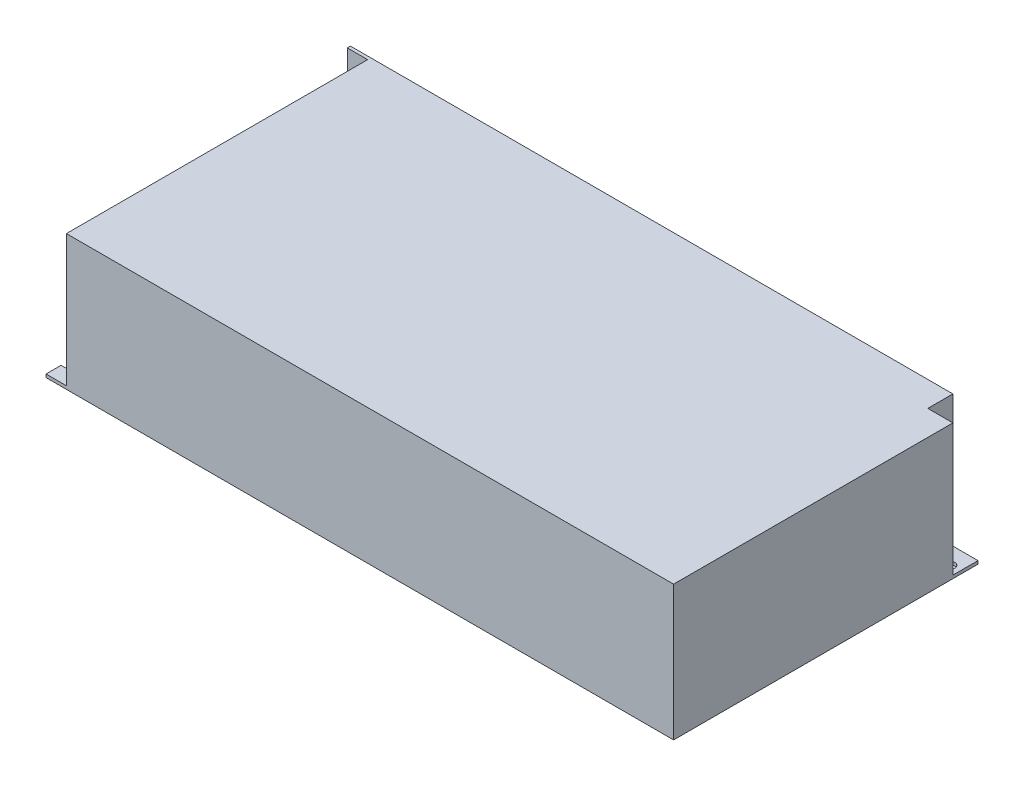
ISO-10303-21;
HEADER;
FILE_DESCRIPTION(('STEP AP214'),'2;1');
FILE_NAME('part.step','',(''),(''),'','','');
FILE_SCHEMA(('AUTOMOTIVE_DESIGN { 1 0 10303 214 1 1 1 1 }'));
ENDSEC;
DATA;
#1=APPLICATION_CONTEXT('core data for automotive mechanical design processes');
#2=APPLICATION_PROTOCOL_DEFINITION('international standard','automotive_design',2000,#1);
#3=PRODUCT_CONTEXT('',#1,'mechanical');
#4=PRODUCT('Part','Part','',(#3));
#5=PRODUCT_RELATED_PRODUCT_CATEGORY('part','',(#4));
#6=PRODUCT_DEFINITION_FORMATION('','',#4);
#7=PRODUCT_DEFINITION_CONTEXT('part definition',#1,'design');
#8=PRODUCT_DEFINITION('design','',#6,#7);
#9=PRODUCT_DEFINITION_SHAPE('','',#8);
#10=(LENGTH_UNIT() NAMED_UNIT(*) SI_UNIT(.MILLI.,.METRE.));
#11=(NAMED_UNIT(*) PLANE_ANGLE_UNIT() SI_UNIT($,.RADIAN.));
#12=(NAMED_UNIT(*) SI_UNIT($,.STERADIAN.) SOLID_ANGLE_UNIT());
#13=UNCERTAINTY_MEASURE_WITH_UNIT(LENGTH_MEASURE(1.E-05),#10,'distance_accuracy_value','');
#14=(GEOMETRIC_REPRESENTATION_CONTEXT(3) GLOBAL_UNCERTAINTY_ASSIGNED_CONTEXT((#13)) GLOBAL_UNIT_ASSIGNED_CONTEXT((#10,
#11,#12)) REPRESENTATION_CONTEXT('',''));
#15=CARTESIAN_POINT('',(0.,0.,0.));
#16=DIRECTION('',(0.,0.,1.));
#17=DIRECTION('',(1.,0.,0.));
#18=AXIS2_PLACEMENT_3D('',#15,#16,#17);
#19=CARTESIAN_POINT('',(-100.,43.,-48.5));
#20=DIRECTION('',(1.,0.,0.));
#21=DIRECTION('',(0.,0.,-1.));
#22=AXIS2_PLACEMENT_3D('',#19,#20,#21);
#23=PLANE('',#22);
#24=DIRECTION('',(0.,0.,-1.));
#25=VECTOR('',#24,1.);
#26=CARTESIAN_POINT('',(-100.,1.,48.5));
#27=LINE('',#26,#25);
#28=CARTESIAN_POINT('',(-100.,1.,48.5));
#29=VERTEX_POINT('',#28);
#30=CARTESIAN_POINT('',(-100.,1.,43.7));
#31=VERTEX_POINT('',#30);
#32=EDGE_CURVE('E206',#29,#31,#27,.T.);
#33=ORIENTED_EDGE('',*,*,#32,.T.);
#34=DIRECTION('',(0.,-1.,0.));
#35=VECTOR('',#34,1.);
#36=CARTESIAN_POINT('',(-100.,43.,43.7));
#37=LINE('',#36,#35);
#38=CARTESIAN_POINT('',(-100.,0.,43.7));
#39=VERTEX_POINT('',#38);
#40=EDGE_CURVE('E195',#31,#39,#37,.T.);
#41=ORIENTED_EDGE('',*,*,#40,.T.);
#42=DIRECTION('',(0.,0.,1.));
#43=VECTOR('',#42,1.);
#44=CARTESIAN_POINT('',(-100.,0.,-48.5));
#45=LINE('',#44,#43);
#46=CARTESIAN_POINT('',(-100.,0.,48.5));
#47=VERTEX_POINT('',#46);
#48=EDGE_CURVE('E281',#39,#47,#45,.T.);
#49=ORIENTED_EDGE('',*,*,#48,.T.);
#50=DIRECTION('',(0.,-1.,0.));
#51=VECTOR('',#50,1.);
#52=CARTESIAN_POINT('',(-100.,43.,48.5));
#53=LINE('',#52,#51);
#54=EDGE_CURVE('E287',#29,#47,#53,.T.);
#55=ORIENTED_EDGE('',*,*,#54,.F.);
#56=EDGE_LOOP('',(#33,#41,#49,#55));
#57=FACE_BOUND('',#56,.T.);
#58=ADVANCED_FACE('F41',(#57),#23,.F.);
#59=CARTESIAN_POINT('',(100.,43.,-48.5));
#60=DIRECTION('',(-1.,0.,0.));
#61=DIRECTION('',(0.,0.,1.));
#62=AXIS2_PLACEMENT_3D('',#59,#60,#61);
#63=PLANE('',#62);
#64=DIRECTION('',(0.,0.,1.));
#65=VECTOR('',#64,1.);
#66=CARTESIAN_POINT('',(100.,1.,-48.5));
#67=LINE('',#66,#65);
#68=CARTESIAN_POINT('',(100.,1.,-48.5));
#69=VERTEX_POINT('',#68);
#70=CARTESIAN_POINT('',(100.,1.,-40.5));
#71=VERTEX_POINT('',#70);
#72=EDGE_CURVE('E220',#69,#71,#67,.T.);
#73=ORIENTED_EDGE('',*,*,#72,.T.);
#74=DIRECTION('',(0.,1.,0.));
#75=VECTOR('',#74,1.);
#76=CARTESIAN_POINT('',(100.,-14.5344418537486,-40.5));
#77=LINE('',#76,#75);
#78=CARTESIAN_POINT('',(100.,43.,-40.5));
#79=VERTEX_POINT('',#78);
#80=EDGE_CURVE('E225',#71,#79,#77,.T.);
#81=ORIENTED_EDGE('',*,*,#80,.T.);
#82=DIRECTION('',(0.,0.,-1.));
#83=VECTOR('',#82,1.);
#84=CARTESIAN_POINT('',(100.,43.,-48.5));
#85=LINE('',#84,#83);
#86=CARTESIAN_POINT('',(100.,43.,48.5));
#87=VERTEX_POINT('',#86);
#88=EDGE_CURVE('E265',#87,#79,#85,.T.);
#89=ORIENTED_EDGE('',*,*,#88,.F.);
#90=DIRECTION('',(0.,-1.,0.));
#91=VECTOR('',#90,1.);
#92=CARTESIAN_POINT('',(100.,43.,48.5));
#93=LINE('',#92,#91);
#94=CARTESIAN_POINT('',(100.,0.,48.5));
#95=VERTEX_POINT('',#94);
#96=EDGE_CURVE('E276',#87,#95,#93,.T.);
#97=ORIENTED_EDGE('',*,*,#96,.T.);
#98=DIRECTION('',(0.,0.,-1.));
#99=VECTOR('',#98,1.);
#100=CARTESIAN_POINT('',(100.,0.,-48.5));
#101=LINE('',#100,#99);
#102=CARTESIAN_POINT('',(100.,0.,-48.5));
#103=VERTEX_POINT('',#102);
#104=EDGE_CURVE('E264',#95,#103,#101,.T.);
#105=ORIENTED_EDGE('',*,*,#104,.T.);
#106=DIRECTION('',(0.,-1.,0.));
#107=VECTOR('',#106,1.);
#108=CARTESIAN_POINT('',(100.,43.,-48.5));
#109=LINE('',#108,#107);
#110=EDGE_CURVE('E293',#69,#103,#109,.T.);
#111=ORIENTED_EDGE('',*,*,#110,.F.);
#112=EDGE_LOOP('',(#73,#81,#89,#97,#105,#111));
#113=FACE_BOUND('',#112,.T.);
#114=ADVANCED_FACE('F43',(#113),#63,.F.);
#115=CARTESIAN_POINT('',(-100.,43.,-48.5));
#116=DIRECTION('',(0.,0.,1.));
#117=DIRECTION('',(1.,0.,0.));
#118=AXIS2_PLACEMENT_3D('',#115,#116,#117);
#119=PLANE('',#118);
#120=DIRECTION('',(-1.,0.,0.));
#121=VECTOR('',#120,1.);
#122=CARTESIAN_POINT('',(-100.,43.,-48.5));
#123=LINE('',#122,#121);
#124=CARTESIAN_POINT('',(91.9999999999999,43.,-48.5));
#125=VERTEX_POINT('',#124);
#126=CARTESIAN_POINT('',(-100.,43.,-48.5));
#127=VERTEX_POINT('',#126);
#128=EDGE_CURVE('E268',#125,#127,#123,.T.);
#129=ORIENTED_EDGE('',*,*,#128,.F.);
#130=DIRECTION('',(0.,1.,0.));
#131=VECTOR('',#130,1.);
#132=CARTESIAN_POINT('',(92.,-14.5344418537486,-48.5));
#133=LINE('',#132,#131);
#134=CARTESIAN_POINT('',(92.,1.,-48.5));
#135=VERTEX_POINT('',#134);
#136=EDGE_CURVE('E64',#135,#125,#133,.T.);
#137=ORIENTED_EDGE('',*,*,#136,.F.);
#138=DIRECTION('',(1.,0.,0.));
#139=VECTOR('',#138,1.);
#140=CARTESIAN_POINT('',(100.,1.,-48.5));
#141=LINE('',#140,#139);
#142=EDGE_CURVE('E198',#135,#69,#141,.T.);
#143=ORIENTED_EDGE('',*,*,#142,.T.);
#144=ORIENTED_EDGE('',*,*,#110,.T.);
#145=DIRECTION('',(-1.,0.,0.));
#146=VECTOR('',#145,1.);
#147=CARTESIAN_POINT('',(-100.,0.,-48.5));
#148=LINE('',#147,#146);
#149=CARTESIAN_POINT('',(-100.,0.,-48.5));
#150=VERTEX_POINT('',#149);
#151=EDGE_CURVE('E279',#103,#150,#148,.T.);
#152=ORIENTED_EDGE('',*,*,#151,.T.);
#153=DIRECTION('',(0.,-1.,0.));
#154=VECTOR('',#153,1.);
#155=CARTESIAN_POINT('',(-100.,43.,-48.5));
#156=LINE('',#155,#154);
#157=EDGE_CURVE('E290',#127,#150,#156,.T.);
#158=ORIENTED_EDGE('',*,*,#157,.F.);
#159=EDGE_LOOP('',(#129,#137,#143,#144,#152,#158));
#160=FACE_BOUND('',#159,.T.);
#161=ADVANCED_FACE('F360',(#160),#119,.F.);
#162=CARTESIAN_POINT('',(-100.,0.,39.9));
#163=VERTEX_POINT('',#162);
#164=EDGE_CURVE('E282',#150,#163,#45,.T.);
#165=ORIENTED_EDGE('',*,*,#164,.T.);
#166=DIRECTION('',(0.,1.,0.));
#167=VECTOR('',#166,1.);
#168=CARTESIAN_POINT('',(-100.,43.,39.9));
#169=LINE('',#168,#167);
#170=CARTESIAN_POINT('',(-100.,1.,39.9));
#171=VERTEX_POINT('',#170);
#172=EDGE_CURVE('E174',#163,#171,#169,.T.);
#173=ORIENTED_EDGE('',*,*,#172,.T.);
#174=CARTESIAN_POINT('',(-100.,1.,35.5));
#175=VERTEX_POINT('',#174);
#176=EDGE_CURVE('E205',#171,#175,#27,.T.);
#177=ORIENTED_EDGE('',*,*,#176,.T.);
#178=DIRECTION('',(0.,1.,0.));
#179=VECTOR('',#178,1.);
#180=CARTESIAN_POINT('',(-100.,-14.5344418537486,35.5));
#181=LINE('',#180,#179);
#182=CARTESIAN_POINT('',(-100.,2.07013091562576,35.5));
#183=VERTEX_POINT('',#182);
#184=EDGE_CURVE('E203',#175,#183,#181,.T.);
#185=ORIENTED_EDGE('',*,*,#184,.T.);
#186=DIRECTION('',(0.,0.,1.));
#187=VECTOR('',#186,1.);
#188=CARTESIAN_POINT('',(-100.,2.07013091562571,-89.942782040592));
#189=LINE('',#188,#187);
#190=CARTESIAN_POINT('',(-100.,2.07013091562571,-47.5));
#191=VERTEX_POINT('',#190);
#192=EDGE_CURVE('E252',#191,#183,#189,.T.);
#193=ORIENTED_EDGE('',*,*,#192,.F.);
#194=DIRECTION('',(0.,1.,0.));
#195=VECTOR('',#194,1.);
#196=CARTESIAN_POINT('',(-100.,43.,-47.5));
#197=LINE('',#196,#195);
#198=CARTESIAN_POINT('',(-100.,43.,-47.5));
#199=VERTEX_POINT('',#198);
#200=EDGE_CURVE('E249',#191,#199,#197,.T.);
#201=ORIENTED_EDGE('',*,*,#200,.T.);
#202=DIRECTION('',(0.,0.,1.));
#203=VECTOR('',#202,1.);
#204=CARTESIAN_POINT('',(-100.,43.,-48.5));
#205=LINE('',#204,#203);
#206=EDGE_CURVE('E271',#127,#199,#205,.T.);
#207=ORIENTED_EDGE('',*,*,#206,.F.);
#208=ORIENTED_EDGE('',*,*,#157,.T.);
#209=EDGE_LOOP('',(#165,#173,#177,#185,#193,#201,#207,#208));
#210=FACE_BOUND('',#209,.T.);
#211=ADVANCED_FACE('F312',(#210),#23,.F.);
#212=CARTESIAN_POINT('',(-100.,43.,48.5));
#213=DIRECTION('',(0.,0.,-1.));
#214=DIRECTION('',(-1.,0.,0.));
#215=AXIS2_PLACEMENT_3D('',#212,#213,#214);
#216=PLANE('',#215);
#217=DIRECTION('',(0.,1.,0.));
#218=VECTOR('',#217,1.);
#219=CARTESIAN_POINT('',(-93.5,43.,48.5));
#220=LINE('',#219,#218);
#221=CARTESIAN_POINT('',(-93.5,1.,48.5));
#222=VERTEX_POINT('',#221);
#223=CARTESIAN_POINT('',(-93.5,43.,48.5));
#224=VERTEX_POINT('',#223);
#225=EDGE_CURVE('E238',#222,#224,#220,.T.);
#226=ORIENTED_EDGE('',*,*,#225,.F.);
#227=DIRECTION('',(-1.,0.,0.));
#228=VECTOR('',#227,1.);
#229=CARTESIAN_POINT('',(-100.,1.,48.5));
#230=LINE('',#229,#228);
#231=EDGE_CURVE('E209',#222,#29,#230,.T.);
#232=ORIENTED_EDGE('',*,*,#231,.T.);
#233=ORIENTED_EDGE('',*,*,#54,.T.);
#234=DIRECTION('',(1.,0.,0.));
#235=VECTOR('',#234,1.);
#236=CARTESIAN_POINT('',(-100.,0.,48.5));
#237=LINE('',#236,#235);
#238=EDGE_CURVE('E269',#47,#95,#237,.T.);
#239=ORIENTED_EDGE('',*,*,#238,.T.);
#240=ORIENTED_EDGE('',*,*,#96,.F.);
#241=DIRECTION('',(1.,0.,0.));
#242=VECTOR('',#241,1.);
#243=CARTESIAN_POINT('',(-100.,43.,48.5));
#244=LINE('',#243,#242);
#245=EDGE_CURVE('E274',#224,#87,#244,.T.);
#246=ORIENTED_EDGE('',*,*,#245,.F.);
#247=EDGE_LOOP('',(#226,#232,#233,#239,#240,#246));
#248=FACE_BOUND('',#247,.T.);
#249=ADVANCED_FACE('F339',(#248),#216,.F.);
#250=CARTESIAN_POINT('',(0.,43.,0.));
#251=DIRECTION('',(0.,1.,0.));
#252=DIRECTION('',(0.,0.,1.));
#253=AXIS2_PLACEMENT_3D('',#250,#251,#252);
#254=PLANE('',#253);
#255=DIRECTION('',(1.,0.,0.));
#256=VECTOR('',#255,1.);
#257=CARTESIAN_POINT('',(100.,43.,-40.5));
#258=LINE('',#257,#256);
#259=CARTESIAN_POINT('',(92.,43.,-40.5));
#260=VERTEX_POINT('',#259);
#261=EDGE_CURVE('E222',#260,#79,#258,.T.);
#262=ORIENTED_EDGE('',*,*,#261,.F.);
#263=DIRECTION('',(0.,0.,1.));
#264=VECTOR('',#263,1.);
#265=CARTESIAN_POINT('',(92.,43.,-48.5));
#266=LINE('',#265,#264);
#267=EDGE_CURVE('E214',#125,#260,#266,.T.);
#268=ORIENTED_EDGE('',*,*,#267,.F.);
#269=ORIENTED_EDGE('',*,*,#128,.T.);
#270=ORIENTED_EDGE('',*,*,#206,.T.);
#271=DIRECTION('',(1.,0.,0.));
#272=VECTOR('',#271,1.);
#273=CARTESIAN_POINT('',(-93.5,43.,-47.5));
#274=LINE('',#273,#272);
#275=CARTESIAN_POINT('',(-93.5,43.,-47.5));
#276=VERTEX_POINT('',#275);
#277=EDGE_CURVE('E246',#199,#276,#274,.T.);
#278=ORIENTED_EDGE('',*,*,#277,.T.);
#279=DIRECTION('',(0.,0.,1.));
#280=VECTOR('',#279,1.);
#281=CARTESIAN_POINT('',(-93.5,43.,-89.942782040592));
#282=LINE('',#281,#280);
#283=EDGE_CURVE('E242',#276,#224,#282,.T.);
#284=ORIENTED_EDGE('',*,*,#283,.T.);
#285=ORIENTED_EDGE('',*,*,#245,.T.);
#286=ORIENTED_EDGE('',*,*,#88,.T.);
#287=EDGE_LOOP('',(#262,#268,#269,#270,#278,#284,#285,#286));
#288=FACE_BOUND('',#287,.T.);
#289=ADVANCED_FACE('F326',(#288),#254,.T.);
#290=CARTESIAN_POINT('',(0.,0.,0.));
#291=DIRECTION('',(0.,1.,0.));
#292=DIRECTION('',(0.,0.,1.));
#293=AXIS2_PLACEMENT_3D('',#290,#291,#292);
#294=PLANE('',#293);
#295=CARTESIAN_POINT('',(96.8,0.,-42.7));
#296=DIRECTION('',(0.,1.,0.));
#297=DIRECTION('',(0.,0.,1.));
#298=AXIS2_PLACEMENT_3D('',#295,#296,#297);
#299=CIRCLE('',#298,1.60000000000001);
#300=CARTESIAN_POINT('',(96.8,0.,-41.1));
#301=VERTEX_POINT('',#300);
#302=EDGE_CURVE('E191',#301,#301,#299,.T.);
#303=ORIENTED_EDGE('',*,*,#302,.T.);
#304=EDGE_LOOP('',(#303));
#305=FACE_BOUND('',#304,.T.);
#306=ORIENTED_EDGE('',*,*,#48,.F.);
#307=DIRECTION('',(1.,0.,0.));
#308=VECTOR('',#307,1.);
#309=CARTESIAN_POINT('',(-97.0019381489076,0.,43.7));
#310=LINE('',#309,#308);
#311=CARTESIAN_POINT('',(-97.0019381489076,0.,43.7));
#312=VERTEX_POINT('',#311);
#313=EDGE_CURVE('E168',#39,#312,#310,.T.);
#314=ORIENTED_EDGE('',*,*,#313,.T.);
#315=CARTESIAN_POINT('',(-97.0019381489076,0.,41.8));
#316=DIRECTION('',(0.,1.,0.));
#317=DIRECTION('',(0.,0.,1.));
#318=AXIS2_PLACEMENT_3D('',#315,#316,#317);
#319=CIRCLE('',#318,1.9);
#320=CARTESIAN_POINT('',(-97.0019381489076,0.,39.9));
#321=VERTEX_POINT('',#320);
#322=EDGE_CURVE('E163',#312,#321,#319,.T.);
#323=ORIENTED_EDGE('',*,*,#322,.T.);
#324=DIRECTION('',(-1.,0.,0.));
#325=VECTOR('',#324,1.);
#326=CARTESIAN_POINT('',(-97.0019381489076,0.,39.9));
#327=LINE('',#326,#325);
#328=EDGE_CURVE('E171',#321,#163,#327,.T.);
#329=ORIENTED_EDGE('',*,*,#328,.T.);
#330=ORIENTED_EDGE('',*,*,#164,.F.);
#331=ORIENTED_EDGE('',*,*,#151,.F.);
#332=ORIENTED_EDGE('',*,*,#104,.F.);
#333=ORIENTED_EDGE('',*,*,#238,.F.);
#334=EDGE_LOOP('',(#306,#314,#323,#329,#330,#331,#332,#333));
#335=FACE_BOUND('',#334,.T.);
#336=ADVANCED_FACE('F180',(#305,#335),#294,.F.);
#337=CARTESIAN_POINT('',(-93.5,43.,-89.942782040592));
#338=DIRECTION('',(1.,0.,0.));
#339=DIRECTION('',(0.,0.,-1.));
#340=AXIS2_PLACEMENT_3D('',#337,#338,#339);
#341=PLANE('',#340);
#342=DIRECTION('',(0.,0.,1.));
#343=VECTOR('',#342,1.);
#344=CARTESIAN_POINT('',(-93.5,17.5,-89.942782040592));
#345=LINE('',#344,#343);
#346=CARTESIAN_POINT('',(-93.5,17.5,-47.5));
#347=VERTEX_POINT('',#346);
#348=CARTESIAN_POINT('',(-93.5,17.5,35.5));
#349=VERTEX_POINT('',#348);
#350=EDGE_CURVE('E254',#347,#349,#345,.T.);
#351=ORIENTED_EDGE('',*,*,#350,.T.);
#352=DIRECTION('',(0.,1.,0.));
#353=VECTOR('',#352,1.);
#354=CARTESIAN_POINT('',(-93.5,-14.5344418537486,35.5));
#355=LINE('',#354,#353);
#356=CARTESIAN_POINT('',(-93.5,1.,35.5));
#357=VERTEX_POINT('',#356);
#358=EDGE_CURVE('E212',#357,#349,#355,.T.);
#359=ORIENTED_EDGE('',*,*,#358,.F.);
#360=DIRECTION('',(0.,0.,1.));
#361=VECTOR('',#360,1.);
#362=CARTESIAN_POINT('',(-93.5,1.,48.5));
#363=LINE('',#362,#361);
#364=EDGE_CURVE('E199',#357,#222,#363,.T.);
#365=ORIENTED_EDGE('',*,*,#364,.T.);
#366=ORIENTED_EDGE('',*,*,#225,.T.);
#367=ORIENTED_EDGE('',*,*,#283,.F.);
#368=DIRECTION('',(0.,-1.,0.));
#369=VECTOR('',#368,1.);
#370=CARTESIAN_POINT('',(-93.5,43.,-47.5));
#371=LINE('',#370,#369);
#372=EDGE_CURVE('E244',#276,#347,#371,.T.);
#373=ORIENTED_EDGE('',*,*,#372,.T.);
#374=EDGE_LOOP('',(#351,#359,#365,#366,#367,#373));
#375=FACE_BOUND('',#374,.T.);
#376=ADVANCED_FACE('F323',(#375),#341,.F.);
#377=CARTESIAN_POINT('',(-106.903846153846,17.5,-89.942782040592));
#378=DIRECTION('',(0.,0.,1.));
#379=DIRECTION('',(1.,0.,0.));
#380=AXIS2_PLACEMENT_3D('',#377,#378,#379);
#381=CYLINDRICAL_SURFACE('',#380,13.4038461538462);
#382=DIRECTION('',(0.,0.,1.));
#383=VECTOR('',#382,1.);
#384=CARTESIAN_POINT('',(-96.8492095303308,8.63617610254807,-89.942782040592));
#385=LINE('',#384,#383);
#386=CARTESIAN_POINT('',(-96.8492095303308,8.63617610254807,-47.5));
#387=VERTEX_POINT('',#386);
#388=CARTESIAN_POINT('',(-96.8492095303308,8.63617610254807,35.5));
#389=VERTEX_POINT('',#388);
#390=EDGE_CURVE('E257',#387,#389,#385,.T.);
#391=ORIENTED_EDGE('',*,*,#390,.T.);
#392=CARTESIAN_POINT('',(-106.903846153846,17.5,35.5));
#393=DIRECTION('',(0.,0.,-1.));
#394=DIRECTION('',(-1.,0.,0.));
#395=AXIS2_PLACEMENT_3D('',#392,#393,#394);
#396=CIRCLE('',#395,13.4038461538462);
#397=EDGE_CURVE('E217',#389,#349,#396,.F.);
#398=ORIENTED_EDGE('',*,*,#397,.T.);
#399=ORIENTED_EDGE('',*,*,#350,.F.);
#400=CARTESIAN_POINT('',(-106.903846153846,17.5,-47.5));
#401=DIRECTION('',(0.,0.,1.));
#402=DIRECTION('',(1.,0.,0.));
#403=AXIS2_PLACEMENT_3D('',#400,#401,#402);
#404=CIRCLE('',#403,13.4038461538462);
#405=EDGE_CURVE('E241',#347,#387,#404,.F.);
#406=ORIENTED_EDGE('',*,*,#405,.T.);
#407=EDGE_LOOP('',(#391,#398,#399,#406));
#408=FACE_BOUND('',#407,.T.);
#409=ADVANCED_FACE('F302',(#408),#381,.F.);
#410=CARTESIAN_POINT('',(-86.7945729068154,-0.227647794903856,-89.942782040592));
#411=DIRECTION('',(0.,0.,1.));
#412=DIRECTION('',(1.,0.,0.));
#413=AXIS2_PLACEMENT_3D('',#410,#411,#412);
#414=CYLINDRICAL_SURFACE('',#413,13.4038461538462);
#415=ORIENTED_EDGE('',*,*,#192,.T.);
#416=CARTESIAN_POINT('',(-86.7945729068154,-0.227647794903856,35.5));
#417=DIRECTION('',(0.,0.,-1.));
#418=DIRECTION('',(-1.,0.,0.));
#419=AXIS2_PLACEMENT_3D('',#416,#417,#418);
#420=CIRCLE('',#419,13.4038461538462);
#421=EDGE_CURVE('E49',#183,#389,#420,.T.);
#422=ORIENTED_EDGE('',*,*,#421,.T.);
#423=ORIENTED_EDGE('',*,*,#390,.F.);
#424=CARTESIAN_POINT('',(-86.7945729068154,-0.227647794903856,-47.5));
#425=DIRECTION('',(0.,0.,1.));
#426=DIRECTION('',(1.,0.,0.));
#427=AXIS2_PLACEMENT_3D('',#424,#425,#426);
#428=CIRCLE('',#427,13.4038461538462);
#429=EDGE_CURVE('E239',#387,#191,#428,.T.);
#430=ORIENTED_EDGE('',*,*,#429,.T.);
#431=EDGE_LOOP('',(#415,#422,#423,#430));
#432=FACE_BOUND('',#431,.T.);
#433=ADVANCED_FACE('F297',(#432),#414,.T.);
#434=CARTESIAN_POINT('',(-100.,43.,-47.5));
#435=DIRECTION('',(0.,0.,1.));
#436=DIRECTION('',(1.,0.,0.));
#437=AXIS2_PLACEMENT_3D('',#434,#435,#436);
#438=PLANE('',#437);
#439=ORIENTED_EDGE('',*,*,#277,.F.);
#440=ORIENTED_EDGE('',*,*,#200,.F.);
#441=ORIENTED_EDGE('',*,*,#429,.F.);
#442=ORIENTED_EDGE('',*,*,#405,.F.);
#443=ORIENTED_EDGE('',*,*,#372,.F.);
#444=EDGE_LOOP('',(#439,#440,#441,#442,#443));
#445=FACE_BOUND('',#444,.T.);
#446=ADVANCED_FACE('F309',(#445),#438,.T.);
#447=CARTESIAN_POINT('',(-100.,-14.5344418537486,35.5));
#448=DIRECTION('',(0.,0.,-1.));
#449=DIRECTION('',(-1.,0.,0.));
#450=AXIS2_PLACEMENT_3D('',#447,#448,#449);
#451=PLANE('',#450);
#452=ORIENTED_EDGE('',*,*,#421,.F.);
#453=ORIENTED_EDGE('',*,*,#184,.F.);
#454=DIRECTION('',(1.,0.,0.));
#455=VECTOR('',#454,1.);
#456=CARTESIAN_POINT('',(-100.,1.,35.5));
#457=LINE('',#456,#455);
#458=EDGE_CURVE('E202',#175,#357,#457,.T.);
#459=ORIENTED_EDGE('',*,*,#458,.T.);
#460=ORIENTED_EDGE('',*,*,#358,.T.);
#461=ORIENTED_EDGE('',*,*,#397,.F.);
#462=EDGE_LOOP('',(#452,#453,#459,#460,#461));
#463=FACE_BOUND('',#462,.T.);
#464=ADVANCED_FACE('F315',(#463),#451,.F.);
#465=CARTESIAN_POINT('',(0.,1.,0.));
#466=DIRECTION('',(0.,1.,0.));
#467=DIRECTION('',(0.,0.,1.));
#468=AXIS2_PLACEMENT_3D('',#465,#466,#467);
#469=PLANE('',#468);
#470=DIRECTION('',(1.,0.,0.));
#471=VECTOR('',#470,1.);
#472=CARTESIAN_POINT('',(0.,1.,43.7));
#473=LINE('',#472,#471);
#474=CARTESIAN_POINT('',(-97.0019381489076,1.,43.7));
#475=VERTEX_POINT('',#474);
#476=EDGE_CURVE('E12',#31,#475,#473,.T.);
#477=ORIENTED_EDGE('',*,*,#476,.F.);
#478=ORIENTED_EDGE('',*,*,#32,.F.);
#479=ORIENTED_EDGE('',*,*,#231,.F.);
#480=ORIENTED_EDGE('',*,*,#364,.F.);
#481=ORIENTED_EDGE('',*,*,#458,.F.);
#482=ORIENTED_EDGE('',*,*,#176,.F.);
#483=DIRECTION('',(-1.,0.,0.));
#484=VECTOR('',#483,1.);
#485=CARTESIAN_POINT('',(-97.0019381489076,1.,39.9));
#486=LINE('',#485,#484);
#487=CARTESIAN_POINT('',(-97.0019381489076,1.,39.9));
#488=VERTEX_POINT('',#487);
#489=EDGE_CURVE('E181',#488,#171,#486,.T.);
#490=ORIENTED_EDGE('',*,*,#489,.F.);
#491=CARTESIAN_POINT('',(-97.0019381489076,1.,41.8));
#492=DIRECTION('',(0.,1.,0.));
#493=DIRECTION('',(0.,0.,1.));
#494=AXIS2_PLACEMENT_3D('',#491,#492,#493);
#495=CIRCLE('',#494,1.9);
#496=EDGE_CURVE('E56',#475,#488,#495,.T.);
#497=ORIENTED_EDGE('',*,*,#496,.F.);
#498=EDGE_LOOP('',(#477,#478,#479,#480,#481,#482,#490,#497));
#499=FACE_BOUND('',#498,.T.);
#500=ADVANCED_FACE('F321',(#499),#469,.T.);
#501=CARTESIAN_POINT('',(100.,-14.5344418537486,-40.5));
#502=DIRECTION('',(0.,0.,1.));
#503=DIRECTION('',(1.,0.,0.));
#504=AXIS2_PLACEMENT_3D('',#501,#502,#503);
#505=PLANE('',#504);
#506=DIRECTION('',(-1.,0.,0.));
#507=VECTOR('',#506,1.);
#508=CARTESIAN_POINT('',(100.,1.,-40.5));
#509=LINE('',#508,#507);
#510=CARTESIAN_POINT('',(92.,1.,-40.5));
#511=VERTEX_POINT('',#510);
#512=EDGE_CURVE('E233',#71,#511,#509,.T.);
#513=ORIENTED_EDGE('',*,*,#512,.T.);
#514=DIRECTION('',(0.,1.,0.));
#515=VECTOR('',#514,1.);
#516=CARTESIAN_POINT('',(92.,-14.5344418537486,-40.5));
#517=LINE('',#516,#515);
#518=EDGE_CURVE('E223',#511,#260,#517,.T.);
#519=ORIENTED_EDGE('',*,*,#518,.T.);
#520=ORIENTED_EDGE('',*,*,#261,.T.);
#521=ORIENTED_EDGE('',*,*,#80,.F.);
#522=EDGE_LOOP('',(#513,#519,#520,#521));
#523=FACE_BOUND('',#522,.T.);
#524=ADVANCED_FACE('F375',(#523),#505,.F.);
#525=CARTESIAN_POINT('',(92.,-14.5344418537486,-48.5));
#526=DIRECTION('',(-1.,0.,0.));
#527=DIRECTION('',(0.,0.,1.));
#528=AXIS2_PLACEMENT_3D('',#525,#526,#527);
#529=PLANE('',#528);
#530=DIRECTION('',(0.,0.,-1.));
#531=VECTOR('',#530,1.);
#532=CARTESIAN_POINT('',(92.,1.,-48.5));
#533=LINE('',#532,#531);
#534=EDGE_CURVE('E228',#511,#135,#533,.T.);
#535=ORIENTED_EDGE('',*,*,#534,.T.);
#536=ORIENTED_EDGE('',*,*,#136,.T.);
#537=ORIENTED_EDGE('',*,*,#267,.T.);
#538=ORIENTED_EDGE('',*,*,#518,.F.);
#539=EDGE_LOOP('',(#535,#536,#537,#538));
#540=FACE_BOUND('',#539,.T.);
#541=ADVANCED_FACE('F376',(#540),#529,.F.);
#542=CARTESIAN_POINT('',(0.,1.,0.));
#543=DIRECTION('',(0.,1.,0.));
#544=DIRECTION('',(0.,0.,1.));
#545=AXIS2_PLACEMENT_3D('',#542,#543,#544);
#546=PLANE('',#545);
#547=CARTESIAN_POINT('',(96.8,1.,-42.7));
#548=DIRECTION('',(0.,1.,0.));
#549=DIRECTION('',(0.,0.,1.));
#550=AXIS2_PLACEMENT_3D('',#547,#548,#549);
#551=CIRCLE('',#550,1.60000000000001);
#552=CARTESIAN_POINT('',(96.8,1.,-41.1));
#553=VERTEX_POINT('',#552);
#554=EDGE_CURVE('E186',#553,#553,#551,.T.);
#555=ORIENTED_EDGE('',*,*,#554,.F.);
#556=EDGE_LOOP('',(#555));
#557=FACE_BOUND('',#556,.T.);
#558=ORIENTED_EDGE('',*,*,#72,.F.);
#559=ORIENTED_EDGE('',*,*,#142,.F.);
#560=ORIENTED_EDGE('',*,*,#534,.F.);
#561=ORIENTED_EDGE('',*,*,#512,.F.);
#562=EDGE_LOOP('',(#558,#559,#560,#561));
#563=FACE_BOUND('',#562,.T.);
#564=ADVANCED_FACE('F352',(#557,#563),#546,.T.);
#565=CARTESIAN_POINT('',(96.8,0.,-42.7));
#566=DIRECTION('',(0.,1.,0.));
#567=DIRECTION('',(0.,0.,1.));
#568=AXIS2_PLACEMENT_3D('',#565,#566,#567);
#569=CYLINDRICAL_SURFACE('',#568,1.60000000000001);
#570=ORIENTED_EDGE('',*,*,#302,.F.);
#571=EDGE_LOOP('',(#570));
#572=FACE_BOUND('',#571,.T.);
#573=ORIENTED_EDGE('',*,*,#554,.T.);
#574=EDGE_LOOP('',(#573));
#575=FACE_BOUND('',#574,.T.);
#576=ADVANCED_FACE('F345',(#572,#575),#569,.F.);
#577=CARTESIAN_POINT('',(-97.0019381489076,0.,43.7));
#578=DIRECTION('',(0.,0.,1.));
#579=DIRECTION('',(1.,0.,0.));
#580=AXIS2_PLACEMENT_3D('',#577,#578,#579);
#581=PLANE('',#580);
#582=ORIENTED_EDGE('',*,*,#476,.T.);
#583=DIRECTION('',(0.,1.,0.));
#584=VECTOR('',#583,1.);
#585=CARTESIAN_POINT('',(-97.0019381489076,0.,43.7));
#586=LINE('',#585,#584);
#587=EDGE_CURVE('E167',#312,#475,#586,.T.);
#588=ORIENTED_EDGE('',*,*,#587,.F.);
#589=ORIENTED_EDGE('',*,*,#313,.F.);
#590=ORIENTED_EDGE('',*,*,#40,.F.);
#591=EDGE_LOOP('',(#582,#588,#589,#590));
#592=FACE_BOUND('',#591,.T.);
#593=ADVANCED_FACE('F343',(#592),#581,.F.);
#594=CARTESIAN_POINT('',(-97.0019381489076,0.,39.9));
#595=DIRECTION('',(0.,0.,-1.));
#596=DIRECTION('',(-1.,0.,0.));
#597=AXIS2_PLACEMENT_3D('',#594,#595,#596);
#598=PLANE('',#597);
#599=ORIENTED_EDGE('',*,*,#328,.F.);
#600=DIRECTION('',(0.,1.,0.));
#601=VECTOR('',#600,1.);
#602=CARTESIAN_POINT('',(-97.0019381489076,0.,39.9));
#603=LINE('',#602,#601);
#604=EDGE_CURVE('E159',#321,#488,#603,.T.);
#605=ORIENTED_EDGE('',*,*,#604,.T.);
#606=ORIENTED_EDGE('',*,*,#489,.T.);
#607=ORIENTED_EDGE('',*,*,#172,.F.);
#608=EDGE_LOOP('',(#599,#605,#606,#607));
#609=FACE_BOUND('',#608,.T.);
#610=ADVANCED_FACE('F172',(#609),#598,.F.);
#611=CARTESIAN_POINT('',(-97.0019381489076,0.,41.8));
#612=DIRECTION('',(0.,1.,0.));
#613=DIRECTION('',(0.,0.,1.));
#614=AXIS2_PLACEMENT_3D('',#611,#612,#613);
#615=CYLINDRICAL_SURFACE('',#614,1.9);
#616=ORIENTED_EDGE('',*,*,#496,.T.);
#617=ORIENTED_EDGE('',*,*,#604,.F.);
#618=ORIENTED_EDGE('',*,*,#322,.F.);
#619=ORIENTED_EDGE('',*,*,#587,.T.);
#620=EDGE_LOOP('',(#616,#617,#618,#619));
#621=FACE_BOUND('',#620,.T.);
#622=ADVANCED_FACE('F161',(#621),#615,.F.);
#623=CLOSED_SHELL('',(#58,#114,#161,#211,#249,#289,#336,#376,#409,#433,#446,#464,#500,#524,#541,
#564,#576,#593,#610,#622));
#624=MANIFOLD_SOLID_BREP('B2',#623);
#625=ADVANCED_BREP_SHAPE_REPRESENTATION('',(#18,#624),#14);
#626=SHAPE_DEFINITION_REPRESENTATION(#9,#625);
ENDSEC;
END-ISO-10303-21;
